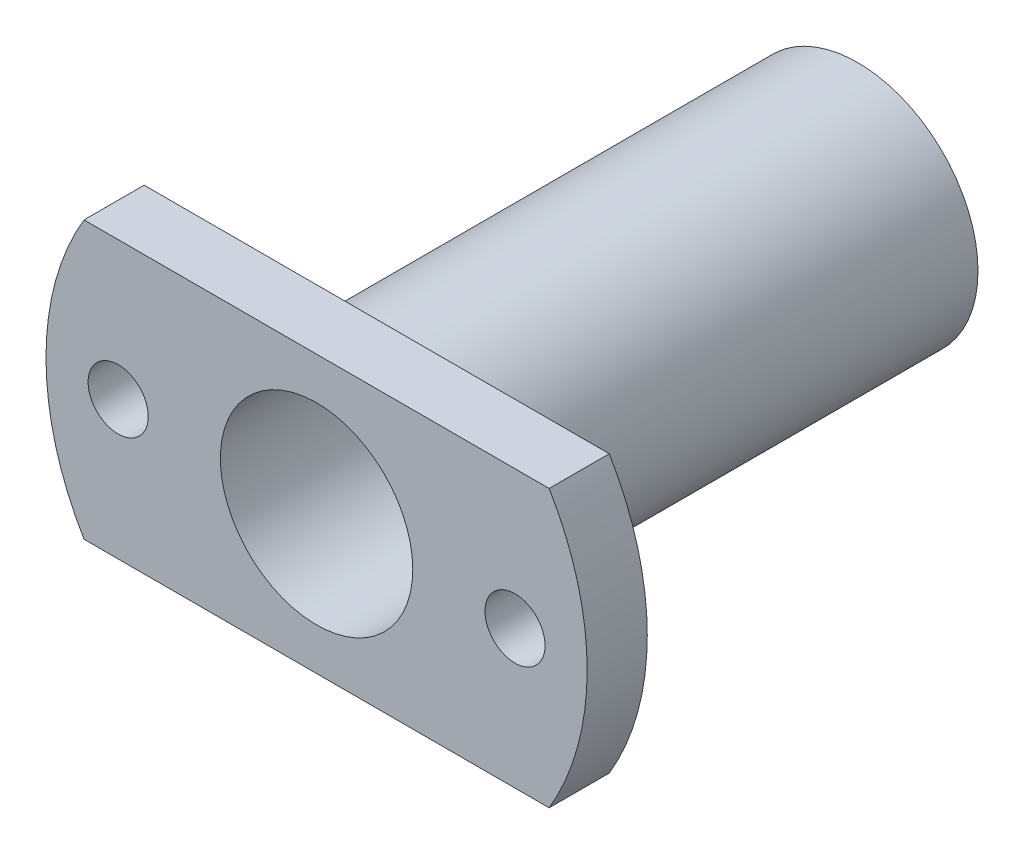
ISO-10303-21;
HEADER;
FILE_DESCRIPTION(('STEP AP214'),'2;1');
FILE_NAME('part.step','',(''),(''),'','','');
FILE_SCHEMA(('AUTOMOTIVE_DESIGN { 1 0 10303 214 1 1 1 1 }'));
ENDSEC;
DATA;
#1=APPLICATION_CONTEXT('core data for automotive mechanical design processes');
#2=APPLICATION_PROTOCOL_DEFINITION('international standard','automotive_design',2000,#1);
#3=PRODUCT_CONTEXT('',#1,'mechanical');
#4=PRODUCT('Part','Part','',(#3));
#5=PRODUCT_RELATED_PRODUCT_CATEGORY('part','',(#4));
#6=PRODUCT_DEFINITION_FORMATION('','',#4);
#7=PRODUCT_DEFINITION_CONTEXT('part definition',#1,'design');
#8=PRODUCT_DEFINITION('design','',#6,#7);
#9=PRODUCT_DEFINITION_SHAPE('','',#8);
#10=(LENGTH_UNIT() NAMED_UNIT(*) SI_UNIT(.MILLI.,.METRE.));
#11=(NAMED_UNIT(*) PLANE_ANGLE_UNIT() SI_UNIT($,.RADIAN.));
#12=(NAMED_UNIT(*) SI_UNIT($,.STERADIAN.) SOLID_ANGLE_UNIT());
#13=UNCERTAINTY_MEASURE_WITH_UNIT(LENGTH_MEASURE(1.E-05),#10,'distance_accuracy_value','');
#14=(GEOMETRIC_REPRESENTATION_CONTEXT(3) GLOBAL_UNCERTAINTY_ASSIGNED_CONTEXT((#13)) GLOBAL_UNIT_ASSIGNED_CONTEXT((#10,
#11,#12)) REPRESENTATION_CONTEXT('',''));
#15=CARTESIAN_POINT('',(0.,0.,0.));
#16=DIRECTION('',(0.,0.,1.));
#17=DIRECTION('',(1.,0.,0.));
#18=AXIS2_PLACEMENT_3D('',#15,#16,#17);
#19=CARTESIAN_POINT('',(0.,0.,0.));
#20=DIRECTION('',(0.,0.,1.));
#21=DIRECTION('',(1.,0.,0.));
#22=AXIS2_PLACEMENT_3D('',#19,#20,#21);
#23=PLANE('',#22);
#24=CARTESIAN_POINT('',(16.5,0.,0.));
#25=DIRECTION('',(0.,0.,1.));
#26=DIRECTION('',(1.,0.,0.));
#27=AXIS2_PLACEMENT_3D('',#24,#25,#26);
#28=CIRCLE('',#27,2.5);
#29=CARTESIAN_POINT('',(19.,0.,0.));
#30=VERTEX_POINT('',#29);
#31=EDGE_CURVE('E200',#30,#30,#28,.T.);
#32=ORIENTED_EDGE('',*,*,#31,.T.);
#33=EDGE_LOOP('',(#32));
#34=FACE_BOUND('',#33,.T.);
#35=CARTESIAN_POINT('',(0.,0.,0.));
#36=DIRECTION('',(0.,0.,1.));
#37=DIRECTION('',(1.,0.,0.));
#38=AXIS2_PLACEMENT_3D('',#35,#36,#37);
#39=CIRCLE('',#38,22.5);
#40=CARTESIAN_POINT('',(19.3390796058137,-11.5,0.));
#41=VERTEX_POINT('',#40);
#42=CARTESIAN_POINT('',(19.3390796058137,11.5,0.));
#43=VERTEX_POINT('',#42);
#44=EDGE_CURVE('E100',#41,#43,#39,.T.);
#45=ORIENTED_EDGE('',*,*,#44,.F.);
#46=DIRECTION('',(1.,0.,0.));
#47=VECTOR('',#46,1.);
#48=CARTESIAN_POINT('',(-19.3390796058137,-11.5,0.));
#49=LINE('',#48,#47);
#50=CARTESIAN_POINT('',(-19.3390796058137,-11.5,0.));
#51=VERTEX_POINT('',#50);
#52=EDGE_CURVE('E72',#51,#41,#49,.T.);
#53=ORIENTED_EDGE('',*,*,#52,.F.);
#54=CARTESIAN_POINT('',(0.,0.,0.));
#55=DIRECTION('',(0.,0.,1.));
#56=DIRECTION('',(1.,0.,0.));
#57=AXIS2_PLACEMENT_3D('',#54,#55,#56);
#58=CIRCLE('',#57,22.5);
#59=CARTESIAN_POINT('',(-19.3390796058137,11.5,0.));
#60=VERTEX_POINT('',#59);
#61=EDGE_CURVE('E66',#60,#51,#58,.T.);
#62=ORIENTED_EDGE('',*,*,#61,.F.);
#63=DIRECTION('',(-1.,0.,0.));
#64=VECTOR('',#63,1.);
#65=CARTESIAN_POINT('',(-19.3390796058137,11.5,0.));
#66=LINE('',#65,#64);
#67=EDGE_CURVE('E91',#43,#60,#66,.T.);
#68=ORIENTED_EDGE('',*,*,#67,.F.);
#69=EDGE_LOOP('',(#45,#53,#62,#68));
#70=FACE_BOUND('',#69,.T.);
#71=CARTESIAN_POINT('',(-16.5,0.,0.));
#72=DIRECTION('',(0.,0.,1.));
#73=DIRECTION('',(1.,0.,0.));
#74=AXIS2_PLACEMENT_3D('',#71,#72,#73);
#75=CIRCLE('',#74,2.5);
#76=CARTESIAN_POINT('',(-14.,0.,0.));
#77=VERTEX_POINT('',#76);
#78=EDGE_CURVE('E118',#77,#77,#75,.T.);
#79=ORIENTED_EDGE('',*,*,#78,.T.);
#80=EDGE_LOOP('',(#79));
#81=FACE_BOUND('',#80,.T.);
#82=CARTESIAN_POINT('',(0.,0.,0.));
#83=DIRECTION('',(0.,0.,1.));
#84=DIRECTION('',(1.,0.,0.));
#85=AXIS2_PLACEMENT_3D('',#82,#83,#84);
#86=CIRCLE('',#85,10.);
#87=CARTESIAN_POINT('',(10.,0.,0.));
#88=VERTEX_POINT('',#87);
#89=EDGE_CURVE('E11',#88,#88,#86,.F.);
#90=ORIENTED_EDGE('',*,*,#89,.F.);
#91=EDGE_LOOP('',(#90));
#92=FACE_BOUND('',#91,.T.);
#93=ADVANCED_FACE('F32',(#34,#70,#81,#92),#23,.F.);
#94=CARTESIAN_POINT('',(0.,0.,5.));
#95=DIRECTION('',(0.,0.,1.));
#96=DIRECTION('',(1.,0.,0.));
#97=AXIS2_PLACEMENT_3D('',#94,#95,#96);
#98=PLANE('',#97);
#99=CARTESIAN_POINT('',(0.,0.,5.));
#100=DIRECTION('',(0.,0.,1.));
#101=DIRECTION('',(1.,0.,0.));
#102=AXIS2_PLACEMENT_3D('',#99,#100,#101);
#103=CIRCLE('',#102,8.);
#104=CARTESIAN_POINT('',(8.,0.,5.));
#105=VERTEX_POINT('',#104);
#106=EDGE_CURVE('E196',#105,#105,#103,.T.);
#107=ORIENTED_EDGE('',*,*,#106,.F.);
#108=EDGE_LOOP('',(#107));
#109=FACE_BOUND('',#108,.T.);
#110=CARTESIAN_POINT('',(-16.5,0.,5.));
#111=DIRECTION('',(0.,0.,1.));
#112=DIRECTION('',(1.,0.,0.));
#113=AXIS2_PLACEMENT_3D('',#110,#111,#112);
#114=CIRCLE('',#113,2.5);
#115=CARTESIAN_POINT('',(-14.,0.,5.));
#116=VERTEX_POINT('',#115);
#117=EDGE_CURVE('E103',#116,#116,#114,.T.);
#118=ORIENTED_EDGE('',*,*,#117,.F.);
#119=EDGE_LOOP('',(#118));
#120=FACE_BOUND('',#119,.T.);
#121=CARTESIAN_POINT('',(0.,0.,5.));
#122=DIRECTION('',(0.,0.,1.));
#123=DIRECTION('',(1.,0.,0.));
#124=AXIS2_PLACEMENT_3D('',#121,#122,#123);
#125=CIRCLE('',#124,22.5);
#126=CARTESIAN_POINT('',(19.3390796058137,-11.5,5.));
#127=VERTEX_POINT('',#126);
#128=CARTESIAN_POINT('',(19.3390796058137,11.5,5.));
#129=VERTEX_POINT('',#128);
#130=EDGE_CURVE('E86',#127,#129,#125,.T.);
#131=ORIENTED_EDGE('',*,*,#130,.T.);
#132=DIRECTION('',(-1.,0.,0.));
#133=VECTOR('',#132,1.);
#134=CARTESIAN_POINT('',(-19.3390796058137,11.5,5.));
#135=LINE('',#134,#133);
#136=CARTESIAN_POINT('',(-19.3390796058137,11.5,5.));
#137=VERTEX_POINT('',#136);
#138=EDGE_CURVE('E80',#129,#137,#135,.T.);
#139=ORIENTED_EDGE('',*,*,#138,.T.);
#140=CARTESIAN_POINT('',(0.,0.,5.));
#141=DIRECTION('',(0.,0.,1.));
#142=DIRECTION('',(1.,0.,0.));
#143=AXIS2_PLACEMENT_3D('',#140,#141,#142);
#144=CIRCLE('',#143,22.5);
#145=CARTESIAN_POINT('',(-19.3390796058137,-11.5,5.));
#146=VERTEX_POINT('',#145);
#147=EDGE_CURVE('E84',#137,#146,#144,.T.);
#148=ORIENTED_EDGE('',*,*,#147,.T.);
#149=DIRECTION('',(1.,0.,0.));
#150=VECTOR('',#149,1.);
#151=CARTESIAN_POINT('',(-19.3390796058137,-11.5,5.));
#152=LINE('',#151,#150);
#153=EDGE_CURVE('E49',#146,#127,#152,.T.);
#154=ORIENTED_EDGE('',*,*,#153,.T.);
#155=EDGE_LOOP('',(#131,#139,#148,#154));
#156=FACE_BOUND('',#155,.T.);
#157=CARTESIAN_POINT('',(16.5,0.,5.));
#158=DIRECTION('',(0.,0.,1.));
#159=DIRECTION('',(1.,0.,0.));
#160=AXIS2_PLACEMENT_3D('',#157,#158,#159);
#161=CIRCLE('',#160,2.5);
#162=CARTESIAN_POINT('',(19.,0.,5.));
#163=VERTEX_POINT('',#162);
#164=EDGE_CURVE('E204',#163,#163,#161,.T.);
#165=ORIENTED_EDGE('',*,*,#164,.F.);
#166=EDGE_LOOP('',(#165));
#167=FACE_BOUND('',#166,.T.);
#168=ADVANCED_FACE('F81',(#109,#120,#156,#167),#98,.T.);
#169=CARTESIAN_POINT('',(0.,0.,5.));
#170=DIRECTION('',(0.,0.,-1.));
#171=DIRECTION('',(-1.,0.,0.));
#172=AXIS2_PLACEMENT_3D('',#169,#170,#171);
#173=CYLINDRICAL_SURFACE('',#172,22.5);
#174=ORIENTED_EDGE('',*,*,#44,.T.);
#175=DIRECTION('',(0.,0.,-1.));
#176=VECTOR('',#175,1.);
#177=CARTESIAN_POINT('',(19.3390796058137,11.5,5.));
#178=LINE('',#177,#176);
#179=EDGE_CURVE('E41',#129,#43,#178,.T.);
#180=ORIENTED_EDGE('',*,*,#179,.F.);
#181=ORIENTED_EDGE('',*,*,#130,.F.);
#182=DIRECTION('',(0.,0.,-1.));
#183=VECTOR('',#182,1.);
#184=CARTESIAN_POINT('',(19.3390796058137,-11.5,5.));
#185=LINE('',#184,#183);
#186=EDGE_CURVE('E96',#127,#41,#185,.T.);
#187=ORIENTED_EDGE('',*,*,#186,.T.);
#188=EDGE_LOOP('',(#174,#180,#181,#187));
#189=FACE_BOUND('',#188,.T.);
#190=ADVANCED_FACE('F34',(#189),#173,.T.);
#191=CARTESIAN_POINT('',(-19.3390796058137,11.5,5.));
#192=DIRECTION('',(0.,-1.,0.));
#193=DIRECTION('',(0.,0.,-1.));
#194=AXIS2_PLACEMENT_3D('',#191,#192,#193);
#195=PLANE('',#194);
#196=ORIENTED_EDGE('',*,*,#67,.T.);
#197=DIRECTION('',(0.,0.,-1.));
#198=VECTOR('',#197,1.);
#199=CARTESIAN_POINT('',(-19.3390796058137,11.5,5.));
#200=LINE('',#199,#198);
#201=EDGE_CURVE('E89',#137,#60,#200,.T.);
#202=ORIENTED_EDGE('',*,*,#201,.F.);
#203=ORIENTED_EDGE('',*,*,#138,.F.);
#204=ORIENTED_EDGE('',*,*,#179,.T.);
#205=EDGE_LOOP('',(#196,#202,#203,#204));
#206=FACE_BOUND('',#205,.T.);
#207=ADVANCED_FACE('F90',(#206),#195,.F.);
#208=CARTESIAN_POINT('',(0.,0.,5.));
#209=DIRECTION('',(0.,0.,-1.));
#210=DIRECTION('',(-1.,0.,0.));
#211=AXIS2_PLACEMENT_3D('',#208,#209,#210);
#212=CYLINDRICAL_SURFACE('',#211,22.5);
#213=ORIENTED_EDGE('',*,*,#61,.T.);
#214=DIRECTION('',(0.,0.,-1.));
#215=VECTOR('',#214,1.);
#216=CARTESIAN_POINT('',(-19.3390796058137,-11.5,5.));
#217=LINE('',#216,#215);
#218=EDGE_CURVE('E92',#146,#51,#217,.T.);
#219=ORIENTED_EDGE('',*,*,#218,.F.);
#220=ORIENTED_EDGE('',*,*,#147,.F.);
#221=ORIENTED_EDGE('',*,*,#201,.T.);
#222=EDGE_LOOP('',(#213,#219,#220,#221));
#223=FACE_BOUND('',#222,.T.);
#224=ADVANCED_FACE('F94',(#223),#212,.T.);
#225=CARTESIAN_POINT('',(-19.3390796058137,-11.5,5.));
#226=DIRECTION('',(0.,1.,0.));
#227=DIRECTION('',(0.,0.,1.));
#228=AXIS2_PLACEMENT_3D('',#225,#226,#227);
#229=PLANE('',#228);
#230=ORIENTED_EDGE('',*,*,#52,.T.);
#231=ORIENTED_EDGE('',*,*,#186,.F.);
#232=ORIENTED_EDGE('',*,*,#153,.F.);
#233=ORIENTED_EDGE('',*,*,#218,.T.);
#234=EDGE_LOOP('',(#230,#231,#232,#233));
#235=FACE_BOUND('',#234,.T.);
#236=ADVANCED_FACE('F142',(#235),#229,.F.);
#237=CARTESIAN_POINT('',(-16.5,0.,5.));
#238=DIRECTION('',(0.,0.,-1.));
#239=DIRECTION('',(-1.,0.,0.));
#240=AXIS2_PLACEMENT_3D('',#237,#238,#239);
#241=CYLINDRICAL_SURFACE('',#240,2.5);
#242=ORIENTED_EDGE('',*,*,#117,.T.);
#243=EDGE_LOOP('',(#242));
#244=FACE_BOUND('',#243,.T.);
#245=ORIENTED_EDGE('',*,*,#78,.F.);
#246=EDGE_LOOP('',(#245));
#247=FACE_BOUND('',#246,.T.);
#248=ADVANCED_FACE('F134',(#244,#247),#241,.F.);
#249=CARTESIAN_POINT('',(16.5,0.,5.));
#250=DIRECTION('',(0.,0.,-1.));
#251=DIRECTION('',(-1.,0.,0.));
#252=AXIS2_PLACEMENT_3D('',#249,#250,#251);
#253=CYLINDRICAL_SURFACE('',#252,2.5);
#254=ORIENTED_EDGE('',*,*,#164,.T.);
#255=EDGE_LOOP('',(#254));
#256=FACE_BOUND('',#255,.T.);
#257=ORIENTED_EDGE('',*,*,#31,.F.);
#258=EDGE_LOOP('',(#257));
#259=FACE_BOUND('',#258,.T.);
#260=ADVANCED_FACE('F124',(#256,#259),#253,.F.);
#261=CARTESIAN_POINT('',(0.,0.,-40.));
#262=DIRECTION('',(0.,0.,1.));
#263=DIRECTION('',(1.,0.,0.));
#264=AXIS2_PLACEMENT_3D('',#261,#262,#263);
#265=CYLINDRICAL_SURFACE('',#264,10.);
#266=CARTESIAN_POINT('',(0.,0.,-40.));
#267=DIRECTION('',(0.,0.,-1.));
#268=DIRECTION('',(-1.,0.,0.));
#269=AXIS2_PLACEMENT_3D('',#266,#267,#268);
#270=CIRCLE('',#269,10.);
#271=CARTESIAN_POINT('',(-10.,0.,-40.));
#272=VERTEX_POINT('',#271);
#273=EDGE_CURVE('E197',#272,#272,#270,.T.);
#274=ORIENTED_EDGE('',*,*,#273,.F.);
#275=EDGE_LOOP('',(#274));
#276=FACE_BOUND('',#275,.T.);
#277=ORIENTED_EDGE('',*,*,#89,.T.);
#278=EDGE_LOOP('',(#277));
#279=FACE_BOUND('',#278,.T.);
#280=ADVANCED_FACE('F121',(#276,#279),#265,.T.);
#281=CARTESIAN_POINT('',(0.,0.,-40.));
#282=DIRECTION('',(0.,0.,-1.));
#283=DIRECTION('',(-1.,0.,0.));
#284=AXIS2_PLACEMENT_3D('',#281,#282,#283);
#285=PLANE('',#284);
#286=CARTESIAN_POINT('',(0.,0.,-40.));
#287=DIRECTION('',(0.,0.,-1.));
#288=DIRECTION('',(-1.,0.,0.));
#289=AXIS2_PLACEMENT_3D('',#286,#287,#288);
#290=CIRCLE('',#289,8.);
#291=CARTESIAN_POINT('',(-8.,0.,-40.));
#292=VERTEX_POINT('',#291);
#293=EDGE_CURVE('E193',#292,#292,#290,.F.);
#294=ORIENTED_EDGE('',*,*,#293,.T.);
#295=EDGE_LOOP('',(#294));
#296=FACE_BOUND('',#295,.T.);
#297=ORIENTED_EDGE('',*,*,#273,.T.);
#298=EDGE_LOOP('',(#297));
#299=FACE_BOUND('',#298,.T.);
#300=ADVANCED_FACE('F123',(#296,#299),#285,.T.);
#301=CARTESIAN_POINT('',(0.,0.,-40.001));
#302=DIRECTION('',(0.,0.,1.));
#303=DIRECTION('',(1.,0.,0.));
#304=AXIS2_PLACEMENT_3D('',#301,#302,#303);
#305=CYLINDRICAL_SURFACE('',#304,8.);
#306=ORIENTED_EDGE('',*,*,#293,.F.);
#307=EDGE_LOOP('',(#306));
#308=FACE_BOUND('',#307,.T.);
#309=ORIENTED_EDGE('',*,*,#106,.T.);
#310=EDGE_LOOP('',(#309));
#311=FACE_BOUND('',#310,.T.);
#312=ADVANCED_FACE('F131',(#308,#311),#305,.F.);
#313=CLOSED_SHELL('',(#93,#168,#190,#207,#224,#236,#248,#260,#280,#300,#312));
#314=MANIFOLD_SOLID_BREP('B2',#313);
#315=ADVANCED_BREP_SHAPE_REPRESENTATION('',(#18,#314),#14);
#316=SHAPE_DEFINITION_REPRESENTATION(#9,#315);
ENDSEC;
END-ISO-10303-21;
